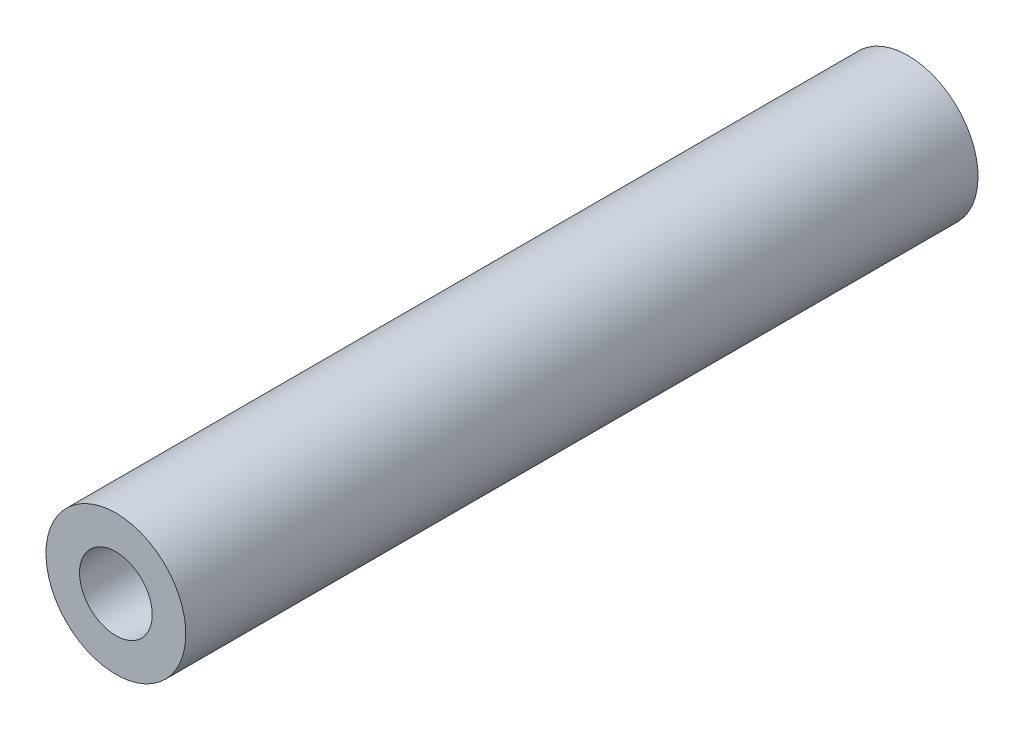
ISO-10303-21;
HEADER;
FILE_DESCRIPTION(('STEP AP214'),'2;1');
FILE_NAME('part.step','',(''),(''),'','','');
FILE_SCHEMA(('AUTOMOTIVE_DESIGN { 1 0 10303 214 1 1 1 1 }'));
ENDSEC;
DATA;
#1=APPLICATION_CONTEXT('core data for automotive mechanical design processes');
#2=APPLICATION_PROTOCOL_DEFINITION('international standard','automotive_design',2000,#1);
#3=PRODUCT_CONTEXT('',#1,'mechanical');
#4=PRODUCT('Part','Part','',(#3));
#5=PRODUCT_RELATED_PRODUCT_CATEGORY('part','',(#4));
#6=PRODUCT_DEFINITION_FORMATION('','',#4);
#7=PRODUCT_DEFINITION_CONTEXT('part definition',#1,'design');
#8=PRODUCT_DEFINITION('design','',#6,#7);
#9=PRODUCT_DEFINITION_SHAPE('','',#8);
#10=(LENGTH_UNIT() NAMED_UNIT(*) SI_UNIT(.MILLI.,.METRE.));
#11=(NAMED_UNIT(*) PLANE_ANGLE_UNIT() SI_UNIT($,.RADIAN.));
#12=(NAMED_UNIT(*) SI_UNIT($,.STERADIAN.) SOLID_ANGLE_UNIT());
#13=UNCERTAINTY_MEASURE_WITH_UNIT(LENGTH_MEASURE(1.E-05),#10,'distance_accuracy_value','');
#14=(GEOMETRIC_REPRESENTATION_CONTEXT(3) GLOBAL_UNCERTAINTY_ASSIGNED_CONTEXT((#13)) GLOBAL_UNIT_ASSIGNED_CONTEXT((#10,
#11,#12)) REPRESENTATION_CONTEXT('',''));
#15=CARTESIAN_POINT('',(0.,0.,0.));
#16=DIRECTION('',(0.,0.,1.));
#17=DIRECTION('',(1.,0.,0.));
#18=AXIS2_PLACEMENT_3D('',#15,#16,#17);
#19=CARTESIAN_POINT('',(12.7,850.9,-104.775));
#20=DIRECTION('',(0.,0.,-1.));
#21=DIRECTION('',(0.,1.,0.));
#22=AXIS2_PLACEMENT_3D('',#19,#20,#21);
#23=PLANE('',#22);
#24=CARTESIAN_POINT('',(12.7,850.9,-104.775));
#25=DIRECTION('',(0.,0.,-1.));
#26=DIRECTION('',(0.,1.,0.));
#27=AXIS2_PLACEMENT_3D('',#24,#25,#26);
#28=CIRCLE('',#27,4.76250000000007);
#29=CARTESIAN_POINT('',(12.7,855.6625,-104.775));
#30=VERTEX_POINT('',#29);
#31=EDGE_CURVE('E10',#30,#30,#28,.T.);
#32=ORIENTED_EDGE('',*,*,#31,.T.);
#33=EDGE_LOOP('',(#32));
#34=FACE_BOUND('',#33,.T.);
#35=CARTESIAN_POINT('',(12.7,850.9,-104.775));
#36=DIRECTION('',(0.,0.,-1.));
#37=DIRECTION('',(0.,1.,0.));
#38=AXIS2_PLACEMENT_3D('',#35,#36,#37);
#39=CIRCLE('',#38,2.47649999999999);
#40=CARTESIAN_POINT('',(12.7,853.3765,-104.775));
#41=VERTEX_POINT('',#40);
#42=EDGE_CURVE('E54',#41,#41,#39,.T.);
#43=ORIENTED_EDGE('',*,*,#42,.F.);
#44=EDGE_LOOP('',(#43));
#45=FACE_BOUND('',#44,.T.);
#46=ADVANCED_FACE('F41',(#34,#45),#23,.T.);
#47=CARTESIAN_POINT('',(12.7,850.9,-50.8));
#48=DIRECTION('',(0.,0.,-1.));
#49=DIRECTION('',(0.,1.,0.));
#50=AXIS2_PLACEMENT_3D('',#47,#48,#49);
#51=PLANE('',#50);
#52=CARTESIAN_POINT('',(12.7,850.9,-50.8));
#53=DIRECTION('',(0.,0.,-1.));
#54=DIRECTION('',(0.,1.,0.));
#55=AXIS2_PLACEMENT_3D('',#52,#53,#54);
#56=CIRCLE('',#55,4.76250000000007);
#57=CARTESIAN_POINT('',(12.7,855.6625,-50.8));
#58=VERTEX_POINT('',#57);
#59=EDGE_CURVE('E45',#58,#58,#56,.T.);
#60=ORIENTED_EDGE('',*,*,#59,.F.);
#61=EDGE_LOOP('',(#60));
#62=FACE_BOUND('',#61,.T.);
#63=CARTESIAN_POINT('',(12.7,850.9,-50.8));
#64=DIRECTION('',(0.,0.,-1.));
#65=DIRECTION('',(0.,1.,0.));
#66=AXIS2_PLACEMENT_3D('',#63,#64,#65);
#67=CIRCLE('',#66,2.47649999999999);
#68=CARTESIAN_POINT('',(12.7,853.3765,-50.8));
#69=VERTEX_POINT('',#68);
#70=EDGE_CURVE('E56',#69,#69,#67,.T.);
#71=ORIENTED_EDGE('',*,*,#70,.T.);
#72=EDGE_LOOP('',(#71));
#73=FACE_BOUND('',#72,.T.);
#74=ADVANCED_FACE('F68',(#62,#73),#51,.F.);
#75=CARTESIAN_POINT('',(12.7,850.9,-104.775));
#76=DIRECTION('',(0.,0.,1.));
#77=DIRECTION('',(0.,-1.,0.));
#78=AXIS2_PLACEMENT_3D('',#75,#76,#77);
#79=CYLINDRICAL_SURFACE('',#78,4.76250000000007);
#80=ORIENTED_EDGE('',*,*,#31,.F.);
#81=EDGE_LOOP('',(#80));
#82=FACE_BOUND('',#81,.T.);
#83=ORIENTED_EDGE('',*,*,#59,.T.);
#84=EDGE_LOOP('',(#83));
#85=FACE_BOUND('',#84,.T.);
#86=ADVANCED_FACE('F43',(#82,#85),#79,.T.);
#87=CARTESIAN_POINT('',(12.7,850.9,-104.775));
#88=DIRECTION('',(0.,0.,1.));
#89=DIRECTION('',(0.,-1.,0.));
#90=AXIS2_PLACEMENT_3D('',#87,#88,#89);
#91=CYLINDRICAL_SURFACE('',#90,2.47649999999999);
#92=ORIENTED_EDGE('',*,*,#42,.T.);
#93=EDGE_LOOP('',(#92));
#94=FACE_BOUND('',#93,.T.);
#95=ORIENTED_EDGE('',*,*,#70,.F.);
#96=EDGE_LOOP('',(#95));
#97=FACE_BOUND('',#96,.T.);
#98=ADVANCED_FACE('F64',(#94,#97),#91,.F.);
#99=CLOSED_SHELL('',(#46,#74,#86,#98));
#100=MANIFOLD_SOLID_BREP('B2',#99);
#101=ADVANCED_BREP_SHAPE_REPRESENTATION('',(#18,#100),#14);
#102=SHAPE_DEFINITION_REPRESENTATION(#9,#101);
ENDSEC;
END-ISO-10303-21;
